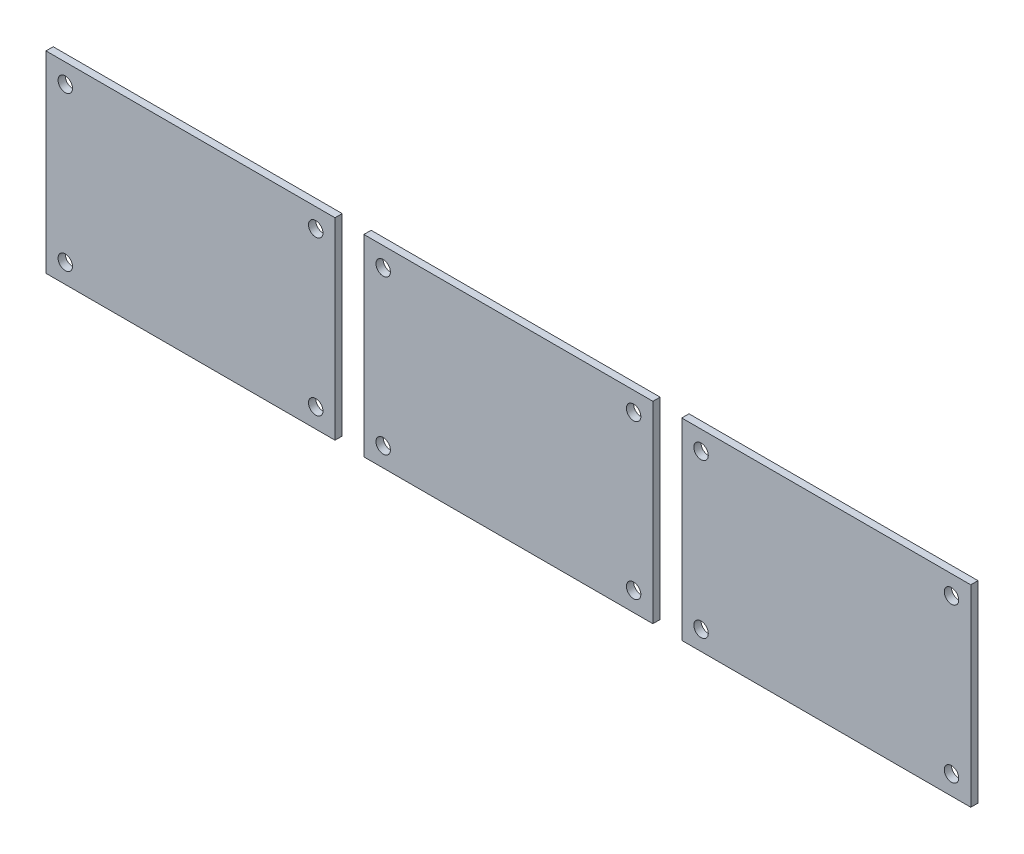
ISO-10303-21;
HEADER;
FILE_DESCRIPTION(('STEP AP214'),'2;1');
FILE_NAME('part.step','',(''),(''),'','','');
FILE_SCHEMA(('AUTOMOTIVE_DESIGN { 1 0 10303 214 1 1 1 1 }'));
ENDSEC;
DATA;
#1=APPLICATION_CONTEXT('core data for automotive mechanical design processes');
#2=APPLICATION_PROTOCOL_DEFINITION('international standard','automotive_design',2000,#1);
#3=PRODUCT_CONTEXT('',#1,'mechanical');
#4=PRODUCT('Part','Part','',(#3));
#5=PRODUCT_RELATED_PRODUCT_CATEGORY('part','',(#4));
#6=PRODUCT_DEFINITION_FORMATION('','',#4);
#7=PRODUCT_DEFINITION_CONTEXT('part definition',#1,'design');
#8=PRODUCT_DEFINITION('design','',#6,#7);
#9=PRODUCT_DEFINITION_SHAPE('','',#8);
#10=(LENGTH_UNIT() NAMED_UNIT(*) SI_UNIT(.MILLI.,.METRE.));
#11=(NAMED_UNIT(*) PLANE_ANGLE_UNIT() SI_UNIT($,.RADIAN.));
#12=(NAMED_UNIT(*) SI_UNIT($,.STERADIAN.) SOLID_ANGLE_UNIT());
#13=UNCERTAINTY_MEASURE_WITH_UNIT(LENGTH_MEASURE(1.E-05),#10,'distance_accuracy_value','');
#14=(GEOMETRIC_REPRESENTATION_CONTEXT(3) GLOBAL_UNCERTAINTY_ASSIGNED_CONTEXT((#13)) GLOBAL_UNIT_ASSIGNED_CONTEXT((#10,
#11,#12)) REPRESENTATION_CONTEXT('',''));
#15=CARTESIAN_POINT('',(0.,0.,0.));
#16=DIRECTION('',(0.,0.,1.));
#17=DIRECTION('',(1.,0.,0.));
#18=AXIS2_PLACEMENT_3D('',#15,#16,#17);
#19=CARTESIAN_POINT('',(0.,0.,1.5));
#20=DIRECTION('',(0.,0.,-1.));
#21=DIRECTION('',(-1.,0.,0.));
#22=AXIS2_PLACEMENT_3D('',#19,#20,#21);
#23=PLANE('',#22);
#24=DIRECTION('',(0.,-1.,0.));
#25=VECTOR('',#24,1.);
#26=CARTESIAN_POINT('',(132.,0.,1.5));
#27=LINE('',#26,#25);
#28=CARTESIAN_POINT('',(132.,40.,1.5));
#29=VERTEX_POINT('',#28);
#30=CARTESIAN_POINT('',(132.,0.,1.5));
#31=VERTEX_POINT('',#30);
#32=EDGE_CURVE('E98',#29,#31,#27,.T.);
#33=ORIENTED_EDGE('',*,*,#32,.T.);
#34=DIRECTION('',(1.,0.,0.));
#35=VECTOR('',#34,1.);
#36=CARTESIAN_POINT('',(132.,0.,1.5));
#37=LINE('',#36,#35);
#38=CARTESIAN_POINT('',(192.,0.,1.5));
#39=VERTEX_POINT('',#38);
#40=EDGE_CURVE('E93',#31,#39,#37,.T.);
#41=ORIENTED_EDGE('',*,*,#40,.T.);
#42=DIRECTION('',(0.,1.,0.));
#43=VECTOR('',#42,1.);
#44=CARTESIAN_POINT('',(192.,0.,1.5));
#45=LINE('',#44,#43);
#46=CARTESIAN_POINT('',(192.,40.,1.5));
#47=VERTEX_POINT('',#46);
#48=EDGE_CURVE('E96',#39,#47,#45,.T.);
#49=ORIENTED_EDGE('',*,*,#48,.T.);
#50=DIRECTION('',(-1.,0.,0.));
#51=VECTOR('',#50,1.);
#52=CARTESIAN_POINT('',(132.,40.,1.5));
#53=LINE('',#52,#51);
#54=EDGE_CURVE('E63',#47,#29,#53,.T.);
#55=ORIENTED_EDGE('',*,*,#54,.T.);
#56=EDGE_LOOP('',(#33,#41,#49,#55));
#57=FACE_BOUND('',#56,.T.);
#58=CARTESIAN_POINT('',(136.,4.,1.5));
#59=DIRECTION('',(0.,0.,1.));
#60=DIRECTION('',(1.,0.,0.));
#61=AXIS2_PLACEMENT_3D('',#58,#59,#60);
#62=CIRCLE('',#61,1.5);
#63=CARTESIAN_POINT('',(137.5,4.,1.5));
#64=VERTEX_POINT('',#63);
#65=EDGE_CURVE('E113',#64,#64,#62,.T.);
#66=ORIENTED_EDGE('',*,*,#65,.F.);
#67=EDGE_LOOP('',(#66));
#68=FACE_BOUND('',#67,.T.);
#69=CARTESIAN_POINT('',(188.,4.,1.5));
#70=DIRECTION('',(0.,0.,1.));
#71=DIRECTION('',(1.,0.,0.));
#72=AXIS2_PLACEMENT_3D('',#69,#70,#71);
#73=CIRCLE('',#72,1.5);
#74=CARTESIAN_POINT('',(189.5,4.,1.5));
#75=VERTEX_POINT('',#74);
#76=EDGE_CURVE('E128',#75,#75,#73,.T.);
#77=ORIENTED_EDGE('',*,*,#76,.F.);
#78=EDGE_LOOP('',(#77));
#79=FACE_BOUND('',#78,.T.);
#80=CARTESIAN_POINT('',(188.,36.,1.5));
#81=DIRECTION('',(0.,0.,1.));
#82=DIRECTION('',(1.,0.,0.));
#83=AXIS2_PLACEMENT_3D('',#80,#81,#82);
#84=CIRCLE('',#83,1.5);
#85=CARTESIAN_POINT('',(189.5,36.,1.5));
#86=VERTEX_POINT('',#85);
#87=EDGE_CURVE('E134',#86,#86,#84,.T.);
#88=ORIENTED_EDGE('',*,*,#87,.F.);
#89=EDGE_LOOP('',(#88));
#90=FACE_BOUND('',#89,.T.);
#91=CARTESIAN_POINT('',(136.,36.,1.5));
#92=DIRECTION('',(0.,0.,1.));
#93=DIRECTION('',(1.,0.,0.));
#94=AXIS2_PLACEMENT_3D('',#91,#92,#93);
#95=CIRCLE('',#94,1.5);
#96=CARTESIAN_POINT('',(137.5,36.,1.5));
#97=VERTEX_POINT('',#96);
#98=EDGE_CURVE('E140',#97,#97,#95,.T.);
#99=ORIENTED_EDGE('',*,*,#98,.F.);
#100=EDGE_LOOP('',(#99));
#101=FACE_BOUND('',#100,.T.);
#102=ADVANCED_FACE('F46',(#57,#68,#79,#90,#101),#23,.F.);
#103=CARTESIAN_POINT('',(0.,0.,0.));
#104=DIRECTION('',(0.,0.,-1.));
#105=DIRECTION('',(-1.,0.,0.));
#106=AXIS2_PLACEMENT_3D('',#103,#104,#105);
#107=PLANE('',#106);
#108=CARTESIAN_POINT('',(188.,36.,0.));
#109=DIRECTION('',(0.,0.,1.));
#110=DIRECTION('',(1.,0.,0.));
#111=AXIS2_PLACEMENT_3D('',#108,#109,#110);
#112=CIRCLE('',#111,1.5);
#113=CARTESIAN_POINT('',(189.5,36.,0.));
#114=VERTEX_POINT('',#113);
#115=EDGE_CURVE('E137',#114,#114,#112,.T.);
#116=ORIENTED_EDGE('',*,*,#115,.T.);
#117=EDGE_LOOP('',(#116));
#118=FACE_BOUND('',#117,.T.);
#119=CARTESIAN_POINT('',(136.,4.,0.));
#120=DIRECTION('',(0.,0.,1.));
#121=DIRECTION('',(1.,0.,0.));
#122=AXIS2_PLACEMENT_3D('',#119,#120,#121);
#123=CIRCLE('',#122,1.5);
#124=CARTESIAN_POINT('',(137.5,4.,0.));
#125=VERTEX_POINT('',#124);
#126=EDGE_CURVE('E125',#125,#125,#123,.T.);
#127=ORIENTED_EDGE('',*,*,#126,.T.);
#128=EDGE_LOOP('',(#127));
#129=FACE_BOUND('',#128,.T.);
#130=DIRECTION('',(0.,-1.,0.));
#131=VECTOR('',#130,1.);
#132=CARTESIAN_POINT('',(132.,0.,0.));
#133=LINE('',#132,#131);
#134=CARTESIAN_POINT('',(132.,40.,0.));
#135=VERTEX_POINT('',#134);
#136=CARTESIAN_POINT('',(132.,0.,0.));
#137=VERTEX_POINT('',#136);
#138=EDGE_CURVE('E110',#135,#137,#133,.T.);
#139=ORIENTED_EDGE('',*,*,#138,.F.);
#140=DIRECTION('',(-1.,0.,0.));
#141=VECTOR('',#140,1.);
#142=CARTESIAN_POINT('',(132.,40.,0.));
#143=LINE('',#142,#141);
#144=CARTESIAN_POINT('',(192.,40.,0.));
#145=VERTEX_POINT('',#144);
#146=EDGE_CURVE('E86',#145,#135,#143,.T.);
#147=ORIENTED_EDGE('',*,*,#146,.F.);
#148=DIRECTION('',(0.,1.,0.));
#149=VECTOR('',#148,1.);
#150=CARTESIAN_POINT('',(192.,0.,0.));
#151=LINE('',#150,#149);
#152=CARTESIAN_POINT('',(192.,0.,0.));
#153=VERTEX_POINT('',#152);
#154=EDGE_CURVE('E80',#153,#145,#151,.T.);
#155=ORIENTED_EDGE('',*,*,#154,.F.);
#156=DIRECTION('',(1.,0.,0.));
#157=VECTOR('',#156,1.);
#158=CARTESIAN_POINT('',(132.,0.,0.));
#159=LINE('',#158,#157);
#160=EDGE_CURVE('E102',#137,#153,#159,.T.);
#161=ORIENTED_EDGE('',*,*,#160,.F.);
#162=EDGE_LOOP('',(#139,#147,#155,#161));
#163=FACE_BOUND('',#162,.T.);
#164=CARTESIAN_POINT('',(188.,4.,0.));
#165=DIRECTION('',(0.,0.,1.));
#166=DIRECTION('',(1.,0.,0.));
#167=AXIS2_PLACEMENT_3D('',#164,#165,#166);
#168=CIRCLE('',#167,1.5);
#169=CARTESIAN_POINT('',(189.5,4.,0.));
#170=VERTEX_POINT('',#169);
#171=EDGE_CURVE('E131',#170,#170,#168,.T.);
#172=ORIENTED_EDGE('',*,*,#171,.T.);
#173=EDGE_LOOP('',(#172));
#174=FACE_BOUND('',#173,.T.);
#175=CARTESIAN_POINT('',(136.,36.,0.));
#176=DIRECTION('',(0.,0.,1.));
#177=DIRECTION('',(1.,0.,0.));
#178=AXIS2_PLACEMENT_3D('',#175,#176,#177);
#179=CIRCLE('',#178,1.5);
#180=CARTESIAN_POINT('',(137.5,36.,0.));
#181=VERTEX_POINT('',#180);
#182=EDGE_CURVE('E143',#181,#181,#179,.T.);
#183=ORIENTED_EDGE('',*,*,#182,.T.);
#184=EDGE_LOOP('',(#183));
#185=FACE_BOUND('',#184,.T.);
#186=ADVANCED_FACE('F121',(#118,#129,#163,#174,#185),#107,.T.);
#187=CARTESIAN_POINT('',(132.,0.,1.5));
#188=DIRECTION('',(1.,0.,0.));
#189=DIRECTION('',(0.,0.,-1.));
#190=AXIS2_PLACEMENT_3D('',#187,#188,#189);
#191=PLANE('',#190);
#192=ORIENTED_EDGE('',*,*,#138,.T.);
#193=DIRECTION('',(0.,0.,-1.));
#194=VECTOR('',#193,1.);
#195=CARTESIAN_POINT('',(132.,0.,1.5));
#196=LINE('',#195,#194);
#197=EDGE_CURVE('E12',#31,#137,#196,.T.);
#198=ORIENTED_EDGE('',*,*,#197,.F.);
#199=ORIENTED_EDGE('',*,*,#32,.F.);
#200=DIRECTION('',(0.,0.,-1.));
#201=VECTOR('',#200,1.);
#202=CARTESIAN_POINT('',(132.,40.,1.5));
#203=LINE('',#202,#201);
#204=EDGE_CURVE('E106',#29,#135,#203,.T.);
#205=ORIENTED_EDGE('',*,*,#204,.T.);
#206=EDGE_LOOP('',(#192,#198,#199,#205));
#207=FACE_BOUND('',#206,.T.);
#208=ADVANCED_FACE('F48',(#207),#191,.F.);
#209=CARTESIAN_POINT('',(132.,0.,1.5));
#210=DIRECTION('',(0.,1.,0.));
#211=DIRECTION('',(0.,0.,1.));
#212=AXIS2_PLACEMENT_3D('',#209,#210,#211);
#213=PLANE('',#212);
#214=ORIENTED_EDGE('',*,*,#160,.T.);
#215=DIRECTION('',(0.,0.,-1.));
#216=VECTOR('',#215,1.);
#217=CARTESIAN_POINT('',(192.,0.,1.5));
#218=LINE('',#217,#216);
#219=EDGE_CURVE('E55',#39,#153,#218,.T.);
#220=ORIENTED_EDGE('',*,*,#219,.F.);
#221=ORIENTED_EDGE('',*,*,#40,.F.);
#222=ORIENTED_EDGE('',*,*,#197,.T.);
#223=EDGE_LOOP('',(#214,#220,#221,#222));
#224=FACE_BOUND('',#223,.T.);
#225=ADVANCED_FACE('F101',(#224),#213,.F.);
#226=CARTESIAN_POINT('',(192.,0.,1.5));
#227=DIRECTION('',(-1.,0.,0.));
#228=DIRECTION('',(0.,0.,1.));
#229=AXIS2_PLACEMENT_3D('',#226,#227,#228);
#230=PLANE('',#229);
#231=ORIENTED_EDGE('',*,*,#154,.T.);
#232=DIRECTION('',(0.,0.,-1.));
#233=VECTOR('',#232,1.);
#234=CARTESIAN_POINT('',(192.,40.,1.5));
#235=LINE('',#234,#233);
#236=EDGE_CURVE('E103',#47,#145,#235,.T.);
#237=ORIENTED_EDGE('',*,*,#236,.F.);
#238=ORIENTED_EDGE('',*,*,#48,.F.);
#239=ORIENTED_EDGE('',*,*,#219,.T.);
#240=EDGE_LOOP('',(#231,#237,#238,#239));
#241=FACE_BOUND('',#240,.T.);
#242=ADVANCED_FACE('F104',(#241),#230,.F.);
#243=CARTESIAN_POINT('',(132.,40.,1.5));
#244=DIRECTION('',(0.,-1.,0.));
#245=DIRECTION('',(0.,0.,-1.));
#246=AXIS2_PLACEMENT_3D('',#243,#244,#245);
#247=PLANE('',#246);
#248=ORIENTED_EDGE('',*,*,#146,.T.);
#249=ORIENTED_EDGE('',*,*,#204,.F.);
#250=ORIENTED_EDGE('',*,*,#54,.F.);
#251=ORIENTED_EDGE('',*,*,#236,.T.);
#252=EDGE_LOOP('',(#248,#249,#250,#251));
#253=FACE_BOUND('',#252,.T.);
#254=ADVANCED_FACE('F118',(#253),#247,.F.);
#255=CARTESIAN_POINT('',(136.,4.,1.5));
#256=DIRECTION('',(0.,0.,-1.));
#257=DIRECTION('',(-1.,0.,0.));
#258=AXIS2_PLACEMENT_3D('',#255,#256,#257);
#259=CYLINDRICAL_SURFACE('',#258,1.5);
#260=ORIENTED_EDGE('',*,*,#65,.T.);
#261=EDGE_LOOP('',(#260));
#262=FACE_BOUND('',#261,.T.);
#263=ORIENTED_EDGE('',*,*,#126,.F.);
#264=EDGE_LOOP('',(#263));
#265=FACE_BOUND('',#264,.T.);
#266=ADVANCED_FACE('F160',(#262,#265),#259,.F.);
#267=CARTESIAN_POINT('',(188.,4.,1.5));
#268=DIRECTION('',(0.,0.,-1.));
#269=DIRECTION('',(-1.,0.,0.));
#270=AXIS2_PLACEMENT_3D('',#267,#268,#269);
#271=CYLINDRICAL_SURFACE('',#270,1.5);
#272=ORIENTED_EDGE('',*,*,#76,.T.);
#273=EDGE_LOOP('',(#272));
#274=FACE_BOUND('',#273,.T.);
#275=ORIENTED_EDGE('',*,*,#171,.F.);
#276=EDGE_LOOP('',(#275));
#277=FACE_BOUND('',#276,.T.);
#278=ADVANCED_FACE('F206',(#274,#277),#271,.F.);
#279=CARTESIAN_POINT('',(188.,36.,1.5));
#280=DIRECTION('',(0.,0.,-1.));
#281=DIRECTION('',(-1.,0.,0.));
#282=AXIS2_PLACEMENT_3D('',#279,#280,#281);
#283=CYLINDRICAL_SURFACE('',#282,1.5);
#284=ORIENTED_EDGE('',*,*,#87,.T.);
#285=EDGE_LOOP('',(#284));
#286=FACE_BOUND('',#285,.T.);
#287=ORIENTED_EDGE('',*,*,#115,.F.);
#288=EDGE_LOOP('',(#287));
#289=FACE_BOUND('',#288,.T.);
#290=ADVANCED_FACE('F214',(#286,#289),#283,.F.);
#291=CARTESIAN_POINT('',(136.,36.,1.5));
#292=DIRECTION('',(0.,0.,-1.));
#293=DIRECTION('',(-1.,0.,0.));
#294=AXIS2_PLACEMENT_3D('',#291,#292,#293);
#295=CYLINDRICAL_SURFACE('',#294,1.5);
#296=ORIENTED_EDGE('',*,*,#98,.T.);
#297=EDGE_LOOP('',(#296));
#298=FACE_BOUND('',#297,.T.);
#299=ORIENTED_EDGE('',*,*,#182,.F.);
#300=EDGE_LOOP('',(#299));
#301=FACE_BOUND('',#300,.T.);
#302=ADVANCED_FACE('F149',(#298,#301),#295,.F.);
#303=CLOSED_SHELL('',(#102,#186,#208,#225,#242,#254,#266,#278,#290,#302));
#304=MANIFOLD_SOLID_BREP('B2',#303);
#305=CARTESIAN_POINT('',(0.,0.,1.5));
#306=DIRECTION('',(0.,0.,-1.));
#307=DIRECTION('',(-1.,0.,0.));
#308=AXIS2_PLACEMENT_3D('',#305,#306,#307);
#309=PLANE('',#308);
#310=DIRECTION('',(0.,-1.,0.));
#311=VECTOR('',#310,1.);
#312=CARTESIAN_POINT('',(66.,0.,1.5));
#313=LINE('',#312,#311);
#314=CARTESIAN_POINT('',(66.,40.,1.5));
#315=VERTEX_POINT('',#314);
#316=CARTESIAN_POINT('',(66.,0.,1.5));
#317=VERTEX_POINT('',#316);
#318=EDGE_CURVE('E315',#315,#317,#313,.T.);
#319=ORIENTED_EDGE('',*,*,#318,.T.);
#320=DIRECTION('',(1.,0.,0.));
#321=VECTOR('',#320,1.);
#322=CARTESIAN_POINT('',(66.,0.,1.5));
#323=LINE('',#322,#321);
#324=CARTESIAN_POINT('',(126.,0.,1.5));
#325=VERTEX_POINT('',#324);
#326=EDGE_CURVE('E310',#317,#325,#323,.T.);
#327=ORIENTED_EDGE('',*,*,#326,.T.);
#328=DIRECTION('',(0.,1.,0.));
#329=VECTOR('',#328,1.);
#330=CARTESIAN_POINT('',(126.,0.,1.5));
#331=LINE('',#330,#329);
#332=CARTESIAN_POINT('',(126.,40.,1.5));
#333=VERTEX_POINT('',#332);
#334=EDGE_CURVE('E313',#325,#333,#331,.T.);
#335=ORIENTED_EDGE('',*,*,#334,.T.);
#336=DIRECTION('',(-1.,0.,0.));
#337=VECTOR('',#336,1.);
#338=CARTESIAN_POINT('',(66.,40.,1.5));
#339=LINE('',#338,#337);
#340=EDGE_CURVE('E280',#333,#315,#339,.T.);
#341=ORIENTED_EDGE('',*,*,#340,.T.);
#342=EDGE_LOOP('',(#319,#327,#335,#341));
#343=FACE_BOUND('',#342,.T.);
#344=CARTESIAN_POINT('',(70.,4.,1.5));
#345=DIRECTION('',(0.,0.,1.));
#346=DIRECTION('',(1.,0.,0.));
#347=AXIS2_PLACEMENT_3D('',#344,#345,#346);
#348=CIRCLE('',#347,1.5);
#349=CARTESIAN_POINT('',(71.5,4.,1.5));
#350=VERTEX_POINT('',#349);
#351=EDGE_CURVE('E330',#350,#350,#348,.T.);
#352=ORIENTED_EDGE('',*,*,#351,.F.);
#353=EDGE_LOOP('',(#352));
#354=FACE_BOUND('',#353,.T.);
#355=CARTESIAN_POINT('',(122.,4.,1.5));
#356=DIRECTION('',(0.,0.,1.));
#357=DIRECTION('',(1.,0.,0.));
#358=AXIS2_PLACEMENT_3D('',#355,#356,#357);
#359=CIRCLE('',#358,1.5);
#360=CARTESIAN_POINT('',(123.5,4.,1.5));
#361=VERTEX_POINT('',#360);
#362=EDGE_CURVE('E345',#361,#361,#359,.T.);
#363=ORIENTED_EDGE('',*,*,#362,.F.);
#364=EDGE_LOOP('',(#363));
#365=FACE_BOUND('',#364,.T.);
#366=CARTESIAN_POINT('',(122.,36.,1.5));
#367=DIRECTION('',(0.,0.,1.));
#368=DIRECTION('',(1.,0.,0.));
#369=AXIS2_PLACEMENT_3D('',#366,#367,#368);
#370=CIRCLE('',#369,1.5);
#371=CARTESIAN_POINT('',(123.5,36.,1.5));
#372=VERTEX_POINT('',#371);
#373=EDGE_CURVE('E351',#372,#372,#370,.T.);
#374=ORIENTED_EDGE('',*,*,#373,.F.);
#375=EDGE_LOOP('',(#374));
#376=FACE_BOUND('',#375,.T.);
#377=CARTESIAN_POINT('',(69.9999999999999,36.,1.5));
#378=DIRECTION('',(0.,0.,1.));
#379=DIRECTION('',(1.,0.,0.));
#380=AXIS2_PLACEMENT_3D('',#377,#378,#379);
#381=CIRCLE('',#380,1.5);
#382=CARTESIAN_POINT('',(71.4999999999999,36.,1.5));
#383=VERTEX_POINT('',#382);
#384=EDGE_CURVE('E357',#383,#383,#381,.T.);
#385=ORIENTED_EDGE('',*,*,#384,.F.);
#386=EDGE_LOOP('',(#385));
#387=FACE_BOUND('',#386,.T.);
#388=ADVANCED_FACE('F263',(#343,#354,#365,#376,#387),#309,.F.);
#389=CARTESIAN_POINT('',(0.,0.,0.));
#390=DIRECTION('',(0.,0.,-1.));
#391=DIRECTION('',(-1.,0.,0.));
#392=AXIS2_PLACEMENT_3D('',#389,#390,#391);
#393=PLANE('',#392);
#394=CARTESIAN_POINT('',(122.,36.,0.));
#395=DIRECTION('',(0.,0.,1.));
#396=DIRECTION('',(1.,0.,0.));
#397=AXIS2_PLACEMENT_3D('',#394,#395,#396);
#398=CIRCLE('',#397,1.5);
#399=CARTESIAN_POINT('',(123.5,36.,0.));
#400=VERTEX_POINT('',#399);
#401=EDGE_CURVE('E354',#400,#400,#398,.T.);
#402=ORIENTED_EDGE('',*,*,#401,.T.);
#403=EDGE_LOOP('',(#402));
#404=FACE_BOUND('',#403,.T.);
#405=CARTESIAN_POINT('',(70.,4.,0.));
#406=DIRECTION('',(0.,0.,1.));
#407=DIRECTION('',(1.,0.,0.));
#408=AXIS2_PLACEMENT_3D('',#405,#406,#407);
#409=CIRCLE('',#408,1.5);
#410=CARTESIAN_POINT('',(71.5,4.,0.));
#411=VERTEX_POINT('',#410);
#412=EDGE_CURVE('E342',#411,#411,#409,.T.);
#413=ORIENTED_EDGE('',*,*,#412,.T.);
#414=EDGE_LOOP('',(#413));
#415=FACE_BOUND('',#414,.T.);
#416=DIRECTION('',(0.,-1.,0.));
#417=VECTOR('',#416,1.);
#418=CARTESIAN_POINT('',(66.,0.,0.));
#419=LINE('',#418,#417);
#420=CARTESIAN_POINT('',(66.,40.,0.));
#421=VERTEX_POINT('',#420);
#422=CARTESIAN_POINT('',(66.,0.,0.));
#423=VERTEX_POINT('',#422);
#424=EDGE_CURVE('E327',#421,#423,#419,.T.);
#425=ORIENTED_EDGE('',*,*,#424,.F.);
#426=DIRECTION('',(-1.,0.,0.));
#427=VECTOR('',#426,1.);
#428=CARTESIAN_POINT('',(66.,40.,0.));
#429=LINE('',#428,#427);
#430=CARTESIAN_POINT('',(126.,40.,0.));
#431=VERTEX_POINT('',#430);
#432=EDGE_CURVE('E303',#431,#421,#429,.T.);
#433=ORIENTED_EDGE('',*,*,#432,.F.);
#434=DIRECTION('',(0.,1.,0.));
#435=VECTOR('',#434,1.);
#436=CARTESIAN_POINT('',(126.,0.,0.));
#437=LINE('',#436,#435);
#438=CARTESIAN_POINT('',(126.,0.,0.));
#439=VERTEX_POINT('',#438);
#440=EDGE_CURVE('E297',#439,#431,#437,.T.);
#441=ORIENTED_EDGE('',*,*,#440,.F.);
#442=DIRECTION('',(1.,0.,0.));
#443=VECTOR('',#442,1.);
#444=CARTESIAN_POINT('',(66.,0.,0.));
#445=LINE('',#444,#443);
#446=EDGE_CURVE('E319',#423,#439,#445,.T.);
#447=ORIENTED_EDGE('',*,*,#446,.F.);
#448=EDGE_LOOP('',(#425,#433,#441,#447));
#449=FACE_BOUND('',#448,.T.);
#450=CARTESIAN_POINT('',(122.,4.,0.));
#451=DIRECTION('',(0.,0.,1.));
#452=DIRECTION('',(1.,0.,0.));
#453=AXIS2_PLACEMENT_3D('',#450,#451,#452);
#454=CIRCLE('',#453,1.5);
#455=CARTESIAN_POINT('',(123.5,4.,0.));
#456=VERTEX_POINT('',#455);
#457=EDGE_CURVE('E348',#456,#456,#454,.T.);
#458=ORIENTED_EDGE('',*,*,#457,.T.);
#459=EDGE_LOOP('',(#458));
#460=FACE_BOUND('',#459,.T.);
#461=CARTESIAN_POINT('',(69.9999999999999,36.,0.));
#462=DIRECTION('',(0.,0.,1.));
#463=DIRECTION('',(1.,0.,0.));
#464=AXIS2_PLACEMENT_3D('',#461,#462,#463);
#465=CIRCLE('',#464,1.5);
#466=CARTESIAN_POINT('',(71.4999999999999,36.,0.));
#467=VERTEX_POINT('',#466);
#468=EDGE_CURVE('E360',#467,#467,#465,.T.);
#469=ORIENTED_EDGE('',*,*,#468,.T.);
#470=EDGE_LOOP('',(#469));
#471=FACE_BOUND('',#470,.T.);
#472=ADVANCED_FACE('F338',(#404,#415,#449,#460,#471),#393,.T.);
#473=CARTESIAN_POINT('',(66.,0.,1.5));
#474=DIRECTION('',(1.,0.,0.));
#475=DIRECTION('',(0.,1.,0.));
#476=AXIS2_PLACEMENT_3D('',#473,#474,#475);
#477=PLANE('',#476);
#478=ORIENTED_EDGE('',*,*,#424,.T.);
#479=DIRECTION('',(0.,0.,-1.));
#480=VECTOR('',#479,1.);
#481=CARTESIAN_POINT('',(66.,0.,1.5));
#482=LINE('',#481,#480);
#483=EDGE_CURVE('E44',#317,#423,#482,.T.);
#484=ORIENTED_EDGE('',*,*,#483,.F.);
#485=ORIENTED_EDGE('',*,*,#318,.F.);
#486=DIRECTION('',(0.,0.,-1.));
#487=VECTOR('',#486,1.);
#488=CARTESIAN_POINT('',(66.,40.,1.5));
#489=LINE('',#488,#487);
#490=EDGE_CURVE('E323',#315,#421,#489,.T.);
#491=ORIENTED_EDGE('',*,*,#490,.T.);
#492=EDGE_LOOP('',(#478,#484,#485,#491));
#493=FACE_BOUND('',#492,.T.);
#494=ADVANCED_FACE('F265',(#493),#477,.F.);
#495=CARTESIAN_POINT('',(66.,0.,1.5));
#496=DIRECTION('',(0.,1.,0.));
#497=DIRECTION('',(0.,0.,1.));
#498=AXIS2_PLACEMENT_3D('',#495,#496,#497);
#499=PLANE('',#498);
#500=ORIENTED_EDGE('',*,*,#446,.T.);
#501=DIRECTION('',(0.,0.,-1.));
#502=VECTOR('',#501,1.);
#503=CARTESIAN_POINT('',(126.,0.,1.5));
#504=LINE('',#503,#502);
#505=EDGE_CURVE('E272',#325,#439,#504,.T.);
#506=ORIENTED_EDGE('',*,*,#505,.F.);
#507=ORIENTED_EDGE('',*,*,#326,.F.);
#508=ORIENTED_EDGE('',*,*,#483,.T.);
#509=EDGE_LOOP('',(#500,#506,#507,#508));
#510=FACE_BOUND('',#509,.T.);
#511=ADVANCED_FACE('F318',(#510),#499,.F.);
#512=CARTESIAN_POINT('',(126.,0.,1.5));
#513=DIRECTION('',(-1.,0.,0.));
#514=DIRECTION('',(0.,0.,1.));
#515=AXIS2_PLACEMENT_3D('',#512,#513,#514);
#516=PLANE('',#515);
#517=ORIENTED_EDGE('',*,*,#440,.T.);
#518=DIRECTION('',(0.,0.,-1.));
#519=VECTOR('',#518,1.);
#520=CARTESIAN_POINT('',(126.,40.,1.5));
#521=LINE('',#520,#519);
#522=EDGE_CURVE('E320',#333,#431,#521,.T.);
#523=ORIENTED_EDGE('',*,*,#522,.F.);
#524=ORIENTED_EDGE('',*,*,#334,.F.);
#525=ORIENTED_EDGE('',*,*,#505,.T.);
#526=EDGE_LOOP('',(#517,#523,#524,#525));
#527=FACE_BOUND('',#526,.T.);
#528=ADVANCED_FACE('F321',(#527),#516,.F.);
#529=CARTESIAN_POINT('',(66.,40.,1.5));
#530=DIRECTION('',(0.,-1.,0.));
#531=DIRECTION('',(0.,0.,-1.));
#532=AXIS2_PLACEMENT_3D('',#529,#530,#531);
#533=PLANE('',#532);
#534=ORIENTED_EDGE('',*,*,#432,.T.);
#535=ORIENTED_EDGE('',*,*,#490,.F.);
#536=ORIENTED_EDGE('',*,*,#340,.F.);
#537=ORIENTED_EDGE('',*,*,#522,.T.);
#538=EDGE_LOOP('',(#534,#535,#536,#537));
#539=FACE_BOUND('',#538,.T.);
#540=ADVANCED_FACE('F335',(#539),#533,.F.);
#541=CARTESIAN_POINT('',(70.,4.,1.5));
#542=DIRECTION('',(0.,0.,-1.));
#543=DIRECTION('',(-1.,0.,0.));
#544=AXIS2_PLACEMENT_3D('',#541,#542,#543);
#545=CYLINDRICAL_SURFACE('',#544,1.5);
#546=ORIENTED_EDGE('',*,*,#351,.T.);
#547=EDGE_LOOP('',(#546));
#548=FACE_BOUND('',#547,.T.);
#549=ORIENTED_EDGE('',*,*,#412,.F.);
#550=EDGE_LOOP('',(#549));
#551=FACE_BOUND('',#550,.T.);
#552=ADVANCED_FACE('F377',(#548,#551),#545,.F.);
#553=CARTESIAN_POINT('',(122.,4.,1.5));
#554=DIRECTION('',(0.,0.,-1.));
#555=DIRECTION('',(-1.,0.,0.));
#556=AXIS2_PLACEMENT_3D('',#553,#554,#555);
#557=CYLINDRICAL_SURFACE('',#556,1.5);
#558=ORIENTED_EDGE('',*,*,#362,.T.);
#559=EDGE_LOOP('',(#558));
#560=FACE_BOUND('',#559,.T.);
#561=ORIENTED_EDGE('',*,*,#457,.F.);
#562=EDGE_LOOP('',(#561));
#563=FACE_BOUND('',#562,.T.);
#564=ADVANCED_FACE('F423',(#560,#563),#557,.F.);
#565=CARTESIAN_POINT('',(122.,36.,1.5));
#566=DIRECTION('',(0.,0.,-1.));
#567=DIRECTION('',(-1.,0.,0.));
#568=AXIS2_PLACEMENT_3D('',#565,#566,#567);
#569=CYLINDRICAL_SURFACE('',#568,1.5);
#570=ORIENTED_EDGE('',*,*,#373,.T.);
#571=EDGE_LOOP('',(#570));
#572=FACE_BOUND('',#571,.T.);
#573=ORIENTED_EDGE('',*,*,#401,.F.);
#574=EDGE_LOOP('',(#573));
#575=FACE_BOUND('',#574,.T.);
#576=ADVANCED_FACE('F431',(#572,#575),#569,.F.);
#577=CARTESIAN_POINT('',(69.9999999999999,36.,1.5));
#578=DIRECTION('',(0.,0.,-1.));
#579=DIRECTION('',(-1.,0.,0.));
#580=AXIS2_PLACEMENT_3D('',#577,#578,#579);
#581=CYLINDRICAL_SURFACE('',#580,1.5);
#582=ORIENTED_EDGE('',*,*,#384,.T.);
#583=EDGE_LOOP('',(#582));
#584=FACE_BOUND('',#583,.T.);
#585=ORIENTED_EDGE('',*,*,#468,.F.);
#586=EDGE_LOOP('',(#585));
#587=FACE_BOUND('',#586,.T.);
#588=ADVANCED_FACE('F366',(#584,#587),#581,.F.);
#589=CLOSED_SHELL('',(#388,#472,#494,#511,#528,#540,#552,#564,#576,#588));
#590=MANIFOLD_SOLID_BREP('B6',#589);
#591=CARTESIAN_POINT('',(0.,0.,1.5));
#592=DIRECTION('',(0.,0.,-1.));
#593=DIRECTION('',(-1.,0.,0.));
#594=AXIS2_PLACEMENT_3D('',#591,#592,#593);
#595=PLANE('',#594);
#596=DIRECTION('',(0.,-1.,0.));
#597=VECTOR('',#596,1.);
#598=CARTESIAN_POINT('',(0.,0.,1.5));
#599=LINE('',#598,#597);
#600=CARTESIAN_POINT('',(0.,40.,1.5));
#601=VERTEX_POINT('',#600);
#602=CARTESIAN_POINT('',(0.,0.,1.5));
#603=VERTEX_POINT('',#602);
#604=EDGE_CURVE('E523',#601,#603,#599,.T.);
#605=ORIENTED_EDGE('',*,*,#604,.T.);
#606=DIRECTION('',(1.,0.,0.));
#607=VECTOR('',#606,1.);
#608=CARTESIAN_POINT('',(0.,0.,1.5));
#609=LINE('',#608,#607);
#610=CARTESIAN_POINT('',(60.,0.,1.5));
#611=VERTEX_POINT('',#610);
#612=EDGE_CURVE('E518',#603,#611,#609,.T.);
#613=ORIENTED_EDGE('',*,*,#612,.T.);
#614=DIRECTION('',(0.,1.,0.));
#615=VECTOR('',#614,1.);
#616=CARTESIAN_POINT('',(60.,0.,1.5));
#617=LINE('',#616,#615);
#618=CARTESIAN_POINT('',(60.,40.,1.5));
#619=VERTEX_POINT('',#618);
#620=EDGE_CURVE('E521',#611,#619,#617,.T.);
#621=ORIENTED_EDGE('',*,*,#620,.T.);
#622=DIRECTION('',(-1.,0.,0.));
#623=VECTOR('',#622,1.);
#624=CARTESIAN_POINT('',(0.,40.,1.5));
#625=LINE('',#624,#623);
#626=EDGE_CURVE('E488',#619,#601,#625,.T.);
#627=ORIENTED_EDGE('',*,*,#626,.T.);
#628=EDGE_LOOP('',(#605,#613,#621,#627));
#629=FACE_BOUND('',#628,.T.);
#630=CARTESIAN_POINT('',(4.,4.,1.5));
#631=DIRECTION('',(0.,0.,1.));
#632=DIRECTION('',(1.,0.,0.));
#633=AXIS2_PLACEMENT_3D('',#630,#631,#632);
#634=CIRCLE('',#633,1.5);
#635=CARTESIAN_POINT('',(5.5,4.,1.5));
#636=VERTEX_POINT('',#635);
#637=EDGE_CURVE('E538',#636,#636,#634,.T.);
#638=ORIENTED_EDGE('',*,*,#637,.F.);
#639=EDGE_LOOP('',(#638));
#640=FACE_BOUND('',#639,.T.);
#641=CARTESIAN_POINT('',(56.,4.,1.5));
#642=DIRECTION('',(0.,0.,1.));
#643=DIRECTION('',(1.,0.,0.));
#644=AXIS2_PLACEMENT_3D('',#641,#642,#643);
#645=CIRCLE('',#644,1.5);
#646=CARTESIAN_POINT('',(57.5,4.,1.5));
#647=VERTEX_POINT('',#646);
#648=EDGE_CURVE('E553',#647,#647,#645,.T.);
#649=ORIENTED_EDGE('',*,*,#648,.F.);
#650=EDGE_LOOP('',(#649));
#651=FACE_BOUND('',#650,.T.);
#652=CARTESIAN_POINT('',(55.9999999999999,36.,1.5));
#653=DIRECTION('',(0.,0.,1.));
#654=DIRECTION('',(1.,0.,0.));
#655=AXIS2_PLACEMENT_3D('',#652,#653,#654);
#656=CIRCLE('',#655,1.5);
#657=CARTESIAN_POINT('',(57.4999999999999,36.,1.5));
#658=VERTEX_POINT('',#657);
#659=EDGE_CURVE('E559',#658,#658,#656,.T.);
#660=ORIENTED_EDGE('',*,*,#659,.F.);
#661=EDGE_LOOP('',(#660));
#662=FACE_BOUND('',#661,.T.);
#663=CARTESIAN_POINT('',(3.99999999999989,36.,1.5));
#664=DIRECTION('',(0.,0.,1.));
#665=DIRECTION('',(1.,0.,0.));
#666=AXIS2_PLACEMENT_3D('',#663,#664,#665);
#667=CIRCLE('',#666,1.5);
#668=CARTESIAN_POINT('',(5.49999999999989,36.,1.5));
#669=VERTEX_POINT('',#668);
#670=EDGE_CURVE('E565',#669,#669,#667,.T.);
#671=ORIENTED_EDGE('',*,*,#670,.F.);
#672=EDGE_LOOP('',(#671));
#673=FACE_BOUND('',#672,.T.);
#674=ADVANCED_FACE('F471',(#629,#640,#651,#662,#673),#595,.F.);
#675=CARTESIAN_POINT('',(0.,0.,0.));
#676=DIRECTION('',(0.,0.,-1.));
#677=DIRECTION('',(-1.,0.,0.));
#678=AXIS2_PLACEMENT_3D('',#675,#676,#677);
#679=PLANE('',#678);
#680=CARTESIAN_POINT('',(55.9999999999999,36.,0.));
#681=DIRECTION('',(0.,0.,1.));
#682=DIRECTION('',(1.,0.,0.));
#683=AXIS2_PLACEMENT_3D('',#680,#681,#682);
#684=CIRCLE('',#683,1.5);
#685=CARTESIAN_POINT('',(57.4999999999999,36.,0.));
#686=VERTEX_POINT('',#685);
#687=EDGE_CURVE('E562',#686,#686,#684,.T.);
#688=ORIENTED_EDGE('',*,*,#687,.T.);
#689=EDGE_LOOP('',(#688));
#690=FACE_BOUND('',#689,.T.);
#691=CARTESIAN_POINT('',(4.,4.,0.));
#692=DIRECTION('',(0.,0.,1.));
#693=DIRECTION('',(1.,0.,0.));
#694=AXIS2_PLACEMENT_3D('',#691,#692,#693);
#695=CIRCLE('',#694,1.5);
#696=CARTESIAN_POINT('',(5.5,4.,0.));
#697=VERTEX_POINT('',#696);
#698=EDGE_CURVE('E550',#697,#697,#695,.T.);
#699=ORIENTED_EDGE('',*,*,#698,.T.);
#700=EDGE_LOOP('',(#699));
#701=FACE_BOUND('',#700,.T.);
#702=DIRECTION('',(0.,-1.,0.));
#703=VECTOR('',#702,1.);
#704=CARTESIAN_POINT('',(0.,0.,0.));
#705=LINE('',#704,#703);
#706=CARTESIAN_POINT('',(0.,40.,0.));
#707=VERTEX_POINT('',#706);
#708=CARTESIAN_POINT('',(0.,0.,0.));
#709=VERTEX_POINT('',#708);
#710=EDGE_CURVE('E535',#707,#709,#705,.T.);
#711=ORIENTED_EDGE('',*,*,#710,.F.);
#712=DIRECTION('',(-1.,0.,0.));
#713=VECTOR('',#712,1.);
#714=CARTESIAN_POINT('',(0.,40.,0.));
#715=LINE('',#714,#713);
#716=CARTESIAN_POINT('',(60.,40.,0.));
#717=VERTEX_POINT('',#716);
#718=EDGE_CURVE('E511',#717,#707,#715,.T.);
#719=ORIENTED_EDGE('',*,*,#718,.F.);
#720=DIRECTION('',(0.,1.,0.));
#721=VECTOR('',#720,1.);
#722=CARTESIAN_POINT('',(60.,0.,0.));
#723=LINE('',#722,#721);
#724=CARTESIAN_POINT('',(60.,0.,0.));
#725=VERTEX_POINT('',#724);
#726=EDGE_CURVE('E505',#725,#717,#723,.T.);
#727=ORIENTED_EDGE('',*,*,#726,.F.);
#728=DIRECTION('',(1.,0.,0.));
#729=VECTOR('',#728,1.);
#730=CARTESIAN_POINT('',(0.,0.,0.));
#731=LINE('',#730,#729);
#732=EDGE_CURVE('E527',#709,#725,#731,.T.);
#733=ORIENTED_EDGE('',*,*,#732,.F.);
#734=EDGE_LOOP('',(#711,#719,#727,#733));
#735=FACE_BOUND('',#734,.T.);
#736=CARTESIAN_POINT('',(56.,4.,0.));
#737=DIRECTION('',(0.,0.,1.));
#738=DIRECTION('',(1.,0.,0.));
#739=AXIS2_PLACEMENT_3D('',#736,#737,#738);
#740=CIRCLE('',#739,1.5);
#741=CARTESIAN_POINT('',(57.5,4.,0.));
#742=VERTEX_POINT('',#741);
#743=EDGE_CURVE('E556',#742,#742,#740,.T.);
#744=ORIENTED_EDGE('',*,*,#743,.T.);
#745=EDGE_LOOP('',(#744));
#746=FACE_BOUND('',#745,.T.);
#747=CARTESIAN_POINT('',(3.99999999999989,36.,0.));
#748=DIRECTION('',(0.,0.,1.));
#749=DIRECTION('',(1.,0.,0.));
#750=AXIS2_PLACEMENT_3D('',#747,#748,#749);
#751=CIRCLE('',#750,1.5);
#752=CARTESIAN_POINT('',(5.49999999999989,36.,0.));
#753=VERTEX_POINT('',#752);
#754=EDGE_CURVE('E568',#753,#753,#751,.T.);
#755=ORIENTED_EDGE('',*,*,#754,.T.);
#756=EDGE_LOOP('',(#755));
#757=FACE_BOUND('',#756,.T.);
#758=ADVANCED_FACE('F546',(#690,#701,#735,#746,#757),#679,.T.);
#759=CARTESIAN_POINT('',(0.,0.,1.5));
#760=DIRECTION('',(1.,0.,0.));
#761=DIRECTION('',(0.,1.,0.));
#762=AXIS2_PLACEMENT_3D('',#759,#760,#761);
#763=PLANE('',#762);
#764=ORIENTED_EDGE('',*,*,#710,.T.);
#765=DIRECTION('',(0.,0.,-1.));
#766=VECTOR('',#765,1.);
#767=CARTESIAN_POINT('',(0.,0.,1.5));
#768=LINE('',#767,#766);
#769=EDGE_CURVE('E261',#603,#709,#768,.T.);
#770=ORIENTED_EDGE('',*,*,#769,.F.);
#771=ORIENTED_EDGE('',*,*,#604,.F.);
#772=DIRECTION('',(0.,0.,-1.));
#773=VECTOR('',#772,1.);
#774=CARTESIAN_POINT('',(0.,40.,1.5));
#775=LINE('',#774,#773);
#776=EDGE_CURVE('E531',#601,#707,#775,.T.);
#777=ORIENTED_EDGE('',*,*,#776,.T.);
#778=EDGE_LOOP('',(#764,#770,#771,#777));
#779=FACE_BOUND('',#778,.T.);
#780=ADVANCED_FACE('F473',(#779),#763,.F.);
#781=CARTESIAN_POINT('',(0.,0.,1.5));
#782=DIRECTION('',(0.,1.,0.));
#783=DIRECTION('',(0.,0.,1.));
#784=AXIS2_PLACEMENT_3D('',#781,#782,#783);
#785=PLANE('',#784);
#786=ORIENTED_EDGE('',*,*,#732,.T.);
#787=DIRECTION('',(0.,0.,-1.));
#788=VECTOR('',#787,1.);
#789=CARTESIAN_POINT('',(60.,0.,1.5));
#790=LINE('',#789,#788);
#791=EDGE_CURVE('E480',#611,#725,#790,.T.);
#792=ORIENTED_EDGE('',*,*,#791,.F.);
#793=ORIENTED_EDGE('',*,*,#612,.F.);
#794=ORIENTED_EDGE('',*,*,#769,.T.);
#795=EDGE_LOOP('',(#786,#792,#793,#794));
#796=FACE_BOUND('',#795,.T.);
#797=ADVANCED_FACE('F526',(#796),#785,.F.);
#798=CARTESIAN_POINT('',(60.,0.,1.5));
#799=DIRECTION('',(-1.,0.,0.));
#800=DIRECTION('',(0.,-1.,0.));
#801=AXIS2_PLACEMENT_3D('',#798,#799,#800);
#802=PLANE('',#801);
#803=ORIENTED_EDGE('',*,*,#726,.T.);
#804=DIRECTION('',(0.,0.,-1.));
#805=VECTOR('',#804,1.);
#806=CARTESIAN_POINT('',(60.,40.,1.5));
#807=LINE('',#806,#805);
#808=EDGE_CURVE('E528',#619,#717,#807,.T.);
#809=ORIENTED_EDGE('',*,*,#808,.F.);
#810=ORIENTED_EDGE('',*,*,#620,.F.);
#811=ORIENTED_EDGE('',*,*,#791,.T.);
#812=EDGE_LOOP('',(#803,#809,#810,#811));
#813=FACE_BOUND('',#812,.T.);
#814=ADVANCED_FACE('F529',(#813),#802,.F.);
#815=CARTESIAN_POINT('',(0.,40.,1.5));
#816=DIRECTION('',(0.,-1.,0.));
#817=DIRECTION('',(0.,0.,-1.));
#818=AXIS2_PLACEMENT_3D('',#815,#816,#817);
#819=PLANE('',#818);
#820=ORIENTED_EDGE('',*,*,#718,.T.);
#821=ORIENTED_EDGE('',*,*,#776,.F.);
#822=ORIENTED_EDGE('',*,*,#626,.F.);
#823=ORIENTED_EDGE('',*,*,#808,.T.);
#824=EDGE_LOOP('',(#820,#821,#822,#823));
#825=FACE_BOUND('',#824,.T.);
#826=ADVANCED_FACE('F543',(#825),#819,.F.);
#827=CARTESIAN_POINT('',(4.,4.,1.5));
#828=DIRECTION('',(0.,0.,-1.));
#829=DIRECTION('',(-1.,0.,0.));
#830=AXIS2_PLACEMENT_3D('',#827,#828,#829);
#831=CYLINDRICAL_SURFACE('',#830,1.5);
#832=ORIENTED_EDGE('',*,*,#637,.T.);
#833=EDGE_LOOP('',(#832));
#834=FACE_BOUND('',#833,.T.);
#835=ORIENTED_EDGE('',*,*,#698,.F.);
#836=EDGE_LOOP('',(#835));
#837=FACE_BOUND('',#836,.T.);
#838=ADVANCED_FACE('F585',(#834,#837),#831,.F.);
#839=CARTESIAN_POINT('',(56.,4.,1.5));
#840=DIRECTION('',(0.,0.,-1.));
#841=DIRECTION('',(-1.,0.,0.));
#842=AXIS2_PLACEMENT_3D('',#839,#840,#841);
#843=CYLINDRICAL_SURFACE('',#842,1.5);
#844=ORIENTED_EDGE('',*,*,#648,.T.);
#845=EDGE_LOOP('',(#844));
#846=FACE_BOUND('',#845,.T.);
#847=ORIENTED_EDGE('',*,*,#743,.F.);
#848=EDGE_LOOP('',(#847));
#849=FACE_BOUND('',#848,.T.);
#850=ADVANCED_FACE('F631',(#846,#849),#843,.F.);
#851=CARTESIAN_POINT('',(55.9999999999999,36.,1.5));
#852=DIRECTION('',(0.,0.,-1.));
#853=DIRECTION('',(-1.,0.,0.));
#854=AXIS2_PLACEMENT_3D('',#851,#852,#853);
#855=CYLINDRICAL_SURFACE('',#854,1.5);
#856=ORIENTED_EDGE('',*,*,#659,.T.);
#857=EDGE_LOOP('',(#856));
#858=FACE_BOUND('',#857,.T.);
#859=ORIENTED_EDGE('',*,*,#687,.F.);
#860=EDGE_LOOP('',(#859));
#861=FACE_BOUND('',#860,.T.);
#862=ADVANCED_FACE('F639',(#858,#861),#855,.F.);
#863=CARTESIAN_POINT('',(3.99999999999989,36.,1.5));
#864=DIRECTION('',(0.,0.,-1.));
#865=DIRECTION('',(-1.,0.,0.));
#866=AXIS2_PLACEMENT_3D('',#863,#864,#865);
#867=CYLINDRICAL_SURFACE('',#866,1.5);
#868=ORIENTED_EDGE('',*,*,#670,.T.);
#869=EDGE_LOOP('',(#868));
#870=FACE_BOUND('',#869,.T.);
#871=ORIENTED_EDGE('',*,*,#754,.F.);
#872=EDGE_LOOP('',(#871));
#873=FACE_BOUND('',#872,.T.);
#874=ADVANCED_FACE('F574',(#870,#873),#867,.F.);
#875=CLOSED_SHELL('',(#674,#758,#780,#797,#814,#826,#838,#850,#862,#874));
#876=MANIFOLD_SOLID_BREP('B38',#875);
#877=ADVANCED_BREP_SHAPE_REPRESENTATION('',(#18,#304,#590,#876),#14);
#878=SHAPE_DEFINITION_REPRESENTATION(#9,#877);
ENDSEC;
END-ISO-10303-21;
